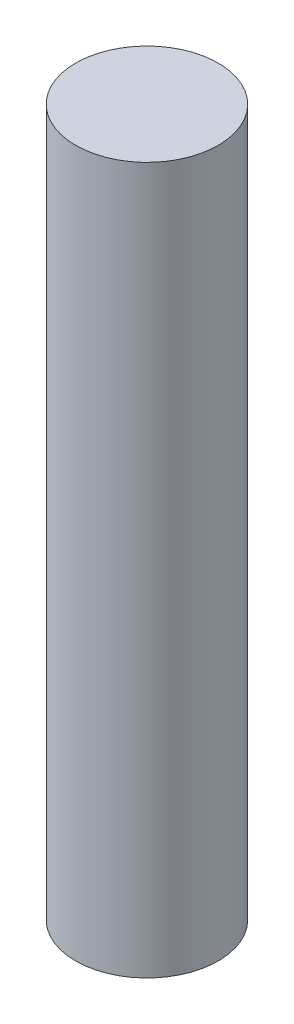
ISO-10303-21;
HEADER;
FILE_DESCRIPTION(('STEP AP214'),'2;1');
FILE_NAME('part.step','',(''),(''),'','','');
FILE_SCHEMA(('AUTOMOTIVE_DESIGN { 1 0 10303 214 1 1 1 1 }'));
ENDSEC;
DATA;
#1=APPLICATION_CONTEXT('core data for automotive mechanical design processes');
#2=APPLICATION_PROTOCOL_DEFINITION('international standard','automotive_design',2000,#1);
#3=PRODUCT_CONTEXT('',#1,'mechanical');
#4=PRODUCT('Part','Part','',(#3));
#5=PRODUCT_RELATED_PRODUCT_CATEGORY('part','',(#4));
#6=PRODUCT_DEFINITION_FORMATION('','',#4);
#7=PRODUCT_DEFINITION_CONTEXT('part definition',#1,'design');
#8=PRODUCT_DEFINITION('design','',#6,#7);
#9=PRODUCT_DEFINITION_SHAPE('','',#8);
#10=(LENGTH_UNIT() NAMED_UNIT(*) SI_UNIT(.MILLI.,.METRE.));
#11=(NAMED_UNIT(*) PLANE_ANGLE_UNIT() SI_UNIT($,.RADIAN.));
#12=(NAMED_UNIT(*) SI_UNIT($,.STERADIAN.) SOLID_ANGLE_UNIT());
#13=UNCERTAINTY_MEASURE_WITH_UNIT(LENGTH_MEASURE(1.E-05),#10,'distance_accuracy_value','');
#14=(GEOMETRIC_REPRESENTATION_CONTEXT(3) GLOBAL_UNCERTAINTY_ASSIGNED_CONTEXT((#13)) GLOBAL_UNIT_ASSIGNED_CONTEXT((#10,
#11,#12)) REPRESENTATION_CONTEXT('',''));
#15=CARTESIAN_POINT('',(0.,0.,0.));
#16=DIRECTION('',(0.,0.,1.));
#17=DIRECTION('',(1.,0.,0.));
#18=AXIS2_PLACEMENT_3D('',#15,#16,#17);
#19=CARTESIAN_POINT('',(-47.0611928017284,44.6,-20.6660020564112));
#20=DIRECTION('',(0.,-1.,0.));
#21=DIRECTION('',(0.,0.,-1.));
#22=AXIS2_PLACEMENT_3D('',#19,#20,#21);
#23=CYLINDRICAL_SURFACE('',#22,4.5);
#24=CARTESIAN_POINT('',(-47.0611928017284,44.6,-20.6660020564112));
#25=DIRECTION('',(0.,1.,0.));
#26=DIRECTION('',(0.,0.,1.));
#27=AXIS2_PLACEMENT_3D('',#24,#25,#26);
#28=CIRCLE('',#27,4.5);
#29=CARTESIAN_POINT('',(-47.0611928017284,44.6,-16.1660020564112));
#30=VERTEX_POINT('',#29);
#31=EDGE_CURVE('E10',#30,#30,#28,.T.);
#32=ORIENTED_EDGE('',*,*,#31,.F.);
#33=EDGE_LOOP('',(#32));
#34=FACE_BOUND('',#33,.T.);
#35=CARTESIAN_POINT('',(-47.0611928017284,0.,-20.6660020564112));
#36=DIRECTION('',(0.,1.,0.));
#37=DIRECTION('',(0.,0.,1.));
#38=AXIS2_PLACEMENT_3D('',#35,#36,#37);
#39=CIRCLE('',#38,4.5);
#40=CARTESIAN_POINT('',(-47.0611928017284,0.,-16.1660020564112));
#41=VERTEX_POINT('',#40);
#42=EDGE_CURVE('E40',#41,#41,#39,.T.);
#43=ORIENTED_EDGE('',*,*,#42,.T.);
#44=EDGE_LOOP('',(#43));
#45=FACE_BOUND('',#44,.T.);
#46=ADVANCED_FACE('F37',(#34,#45),#23,.T.);
#47=CARTESIAN_POINT('',(-47.0611928017284,44.6,-20.6660020564112));
#48=DIRECTION('',(0.,1.,0.));
#49=DIRECTION('',(0.,0.,1.));
#50=AXIS2_PLACEMENT_3D('',#47,#48,#49);
#51=PLANE('',#50);
#52=ORIENTED_EDGE('',*,*,#31,.T.);
#53=EDGE_LOOP('',(#52));
#54=FACE_BOUND('',#53,.T.);
#55=ADVANCED_FACE('F54',(#54),#51,.T.);
#56=CARTESIAN_POINT('',(-47.0611928017284,0.,-20.6660020564112));
#57=DIRECTION('',(0.,1.,0.));
#58=DIRECTION('',(0.,0.,1.));
#59=AXIS2_PLACEMENT_3D('',#56,#57,#58);
#60=PLANE('',#59);
#61=ORIENTED_EDGE('',*,*,#42,.F.);
#62=EDGE_LOOP('',(#61));
#63=FACE_BOUND('',#62,.T.);
#64=ADVANCED_FACE('F52',(#63),#60,.F.);
#65=CLOSED_SHELL('',(#46,#55,#64));
#66=MANIFOLD_SOLID_BREP('B2',#65);
#67=ADVANCED_BREP_SHAPE_REPRESENTATION('',(#18,#66),#14);
#68=SHAPE_DEFINITION_REPRESENTATION(#9,#67);
ENDSEC;
END-ISO-10303-21;
